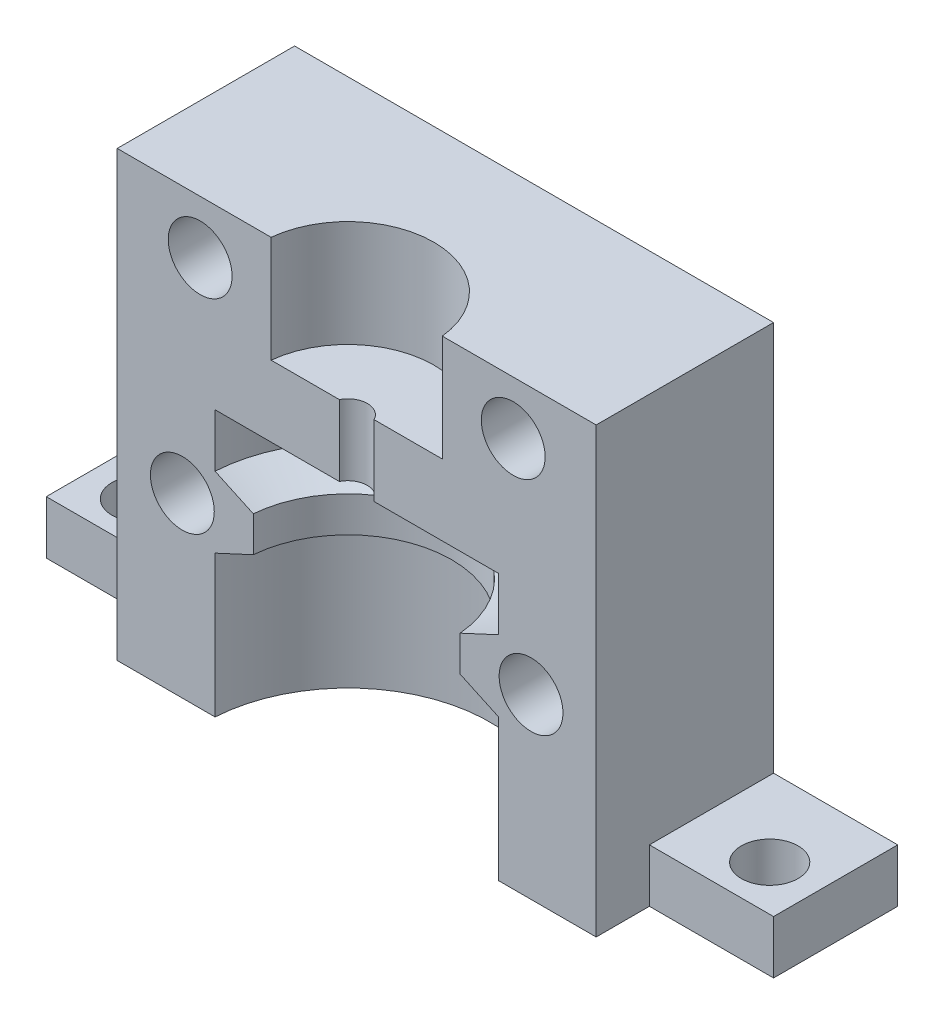
ISO-10303-21;
HEADER;
FILE_DESCRIPTION(('STEP AP214'),'2;1');
FILE_NAME('part.step','',(''),(''),'','','');
FILE_SCHEMA(('AUTOMOTIVE_DESIGN { 1 0 10303 214 1 1 1 1 }'));
ENDSEC;
DATA;
#1=APPLICATION_CONTEXT('core data for automotive mechanical design processes');
#2=APPLICATION_PROTOCOL_DEFINITION('international standard','automotive_design',2000,#1);
#3=PRODUCT_CONTEXT('',#1,'mechanical');
#4=PRODUCT('Part','Part','',(#3));
#5=PRODUCT_RELATED_PRODUCT_CATEGORY('part','',(#4));
#6=PRODUCT_DEFINITION_FORMATION('','',#4);
#7=PRODUCT_DEFINITION_CONTEXT('part definition',#1,'design');
#8=PRODUCT_DEFINITION('design','',#6,#7);
#9=PRODUCT_DEFINITION_SHAPE('','',#8);
#10=(LENGTH_UNIT() NAMED_UNIT(*) SI_UNIT(.MILLI.,.METRE.));
#11=(NAMED_UNIT(*) PLANE_ANGLE_UNIT() SI_UNIT($,.RADIAN.));
#12=(NAMED_UNIT(*) SI_UNIT($,.STERADIAN.) SOLID_ANGLE_UNIT());
#13=UNCERTAINTY_MEASURE_WITH_UNIT(LENGTH_MEASURE(1.E-05),#10,'distance_accuracy_value','');
#14=(GEOMETRIC_REPRESENTATION_CONTEXT(3) GLOBAL_UNCERTAINTY_ASSIGNED_CONTEXT((#13)) GLOBAL_UNIT_ASSIGNED_CONTEXT((#10,
#11,#12)) REPRESENTATION_CONTEXT('',''));
#15=CARTESIAN_POINT('',(0.,0.,0.));
#16=DIRECTION('',(0.,0.,1.));
#17=DIRECTION('',(1.,0.,0.));
#18=AXIS2_PLACEMENT_3D('',#15,#16,#17);
#19=CARTESIAN_POINT('',(-13.5,0.,0.));
#20=DIRECTION('',(0.,1.,0.));
#21=DIRECTION('',(0.,0.,1.));
#22=AXIS2_PLACEMENT_3D('',#19,#20,#21);
#23=PLANE('',#22);
#24=DIRECTION('',(1.,0.,0.));
#25=VECTOR('',#24,1.);
#26=CARTESIAN_POINT('',(-13.5,0.,0.));
#27=LINE('',#26,#25);
#28=CARTESIAN_POINT('',(7.98435971133566,0.,0.));
#29=VERTEX_POINT('',#28);
#30=CARTESIAN_POINT('',(13.5,0.,0.));
#31=VERTEX_POINT('',#30);
#32=EDGE_CURVE('E249',#29,#31,#27,.T.);
#33=ORIENTED_EDGE('',*,*,#32,.F.);
#34=CARTESIAN_POINT('',(0.,0.,0.499999999999999));
#35=DIRECTION('',(0.,1.,0.));
#36=DIRECTION('',(0.,0.,1.));
#37=AXIS2_PLACEMENT_3D('',#34,#35,#36);
#38=CIRCLE('',#37,8.);
#39=CARTESIAN_POINT('',(-7.98435971133566,0.,0.));
#40=VERTEX_POINT('',#39);
#41=EDGE_CURVE('E460',#29,#40,#38,.T.);
#42=ORIENTED_EDGE('',*,*,#41,.T.);
#43=CARTESIAN_POINT('',(-13.5,0.,0.));
#44=VERTEX_POINT('',#43);
#45=EDGE_CURVE('E256',#44,#40,#27,.T.);
#46=ORIENTED_EDGE('',*,*,#45,.F.);
#47=DIRECTION('',(0.,0.,1.));
#48=VECTOR('',#47,1.);
#49=CARTESIAN_POINT('',(-13.5,0.,-10.));
#50=LINE('',#49,#48);
#51=CARTESIAN_POINT('',(-13.5,0.,-3.));
#52=VERTEX_POINT('',#51);
#53=EDGE_CURVE('E247',#52,#44,#50,.T.);
#54=ORIENTED_EDGE('',*,*,#53,.F.);
#55=DIRECTION('',(1.,0.,0.));
#56=VECTOR('',#55,1.);
#57=CARTESIAN_POINT('',(-13.5,0.,-3.));
#58=LINE('',#57,#56);
#59=CARTESIAN_POINT('',(-20.5,0.,-3.));
#60=VERTEX_POINT('',#59);
#61=EDGE_CURVE('E54',#60,#52,#58,.T.);
#62=ORIENTED_EDGE('',*,*,#61,.F.);
#63=DIRECTION('',(0.,0.,1.));
#64=VECTOR('',#63,1.);
#65=CARTESIAN_POINT('',(-20.5,0.,-3.));
#66=LINE('',#65,#64);
#67=CARTESIAN_POINT('',(-20.5,0.,-10.));
#68=VERTEX_POINT('',#67);
#69=EDGE_CURVE('E198',#68,#60,#66,.T.);
#70=ORIENTED_EDGE('',*,*,#69,.F.);
#71=DIRECTION('',(-1.,0.,0.));
#72=VECTOR('',#71,1.);
#73=CARTESIAN_POINT('',(-13.5,0.,-10.));
#74=LINE('',#73,#72);
#75=CARTESIAN_POINT('',(20.5,0.,-10.));
#76=VERTEX_POINT('',#75);
#77=EDGE_CURVE('E262',#76,#68,#74,.T.);
#78=ORIENTED_EDGE('',*,*,#77,.F.);
#79=DIRECTION('',(0.,0.,1.));
#80=VECTOR('',#79,1.);
#81=CARTESIAN_POINT('',(20.5,0.,-3.));
#82=LINE('',#81,#80);
#83=CARTESIAN_POINT('',(20.5,0.,-3.));
#84=VERTEX_POINT('',#83);
#85=EDGE_CURVE('E222',#76,#84,#82,.T.);
#86=ORIENTED_EDGE('',*,*,#85,.T.);
#87=DIRECTION('',(-1.,0.,0.));
#88=VECTOR('',#87,1.);
#89=CARTESIAN_POINT('',(13.5,0.,-3.));
#90=LINE('',#89,#88);
#91=CARTESIAN_POINT('',(13.5,0.,-3.));
#92=VERTEX_POINT('',#91);
#93=EDGE_CURVE('E231',#84,#92,#90,.T.);
#94=ORIENTED_EDGE('',*,*,#93,.T.);
#95=DIRECTION('',(0.,0.,-1.));
#96=VECTOR('',#95,1.);
#97=CARTESIAN_POINT('',(13.5,0.,-10.));
#98=LINE('',#97,#96);
#99=EDGE_CURVE('E259',#31,#92,#98,.T.);
#100=ORIENTED_EDGE('',*,*,#99,.F.);
#101=EDGE_LOOP('',(#33,#42,#46,#54,#62,#70,#78,#86,#94,#100));
#102=FACE_BOUND('',#101,.T.);
#103=CARTESIAN_POINT('',(17.7373503171622,0.,-5.54426134233362));
#104=DIRECTION('',(0.,-1.,0.));
#105=DIRECTION('',(0.,0.,-1.));
#106=AXIS2_PLACEMENT_3D('',#103,#104,#105);
#107=CIRCLE('',#106,1.60000000000001);
#108=CARTESIAN_POINT('',(17.7373503171622,0.,-7.14426134233363));
#109=VERTEX_POINT('',#108);
#110=EDGE_CURVE('E215',#109,#109,#107,.T.);
#111=ORIENTED_EDGE('',*,*,#110,.F.);
#112=EDGE_LOOP('',(#111));
#113=FACE_BOUND('',#112,.T.);
#114=CARTESIAN_POINT('',(-17.7373503171622,0.,-5.54426134233362));
#115=DIRECTION('',(0.,1.,0.));
#116=DIRECTION('',(0.,0.,-1.));
#117=AXIS2_PLACEMENT_3D('',#114,#115,#116);
#118=CIRCLE('',#117,1.60000000000001);
#119=CARTESIAN_POINT('',(-17.7373503171622,0.,-7.14426134233363));
#120=VERTEX_POINT('',#119);
#121=EDGE_CURVE('E206',#120,#120,#118,.T.);
#122=ORIENTED_EDGE('',*,*,#121,.T.);
#123=EDGE_LOOP('',(#122));
#124=FACE_BOUND('',#123,.T.);
#125=ADVANCED_FACE('F37',(#102,#113,#124),#23,.F.);
#126=CARTESIAN_POINT('',(-13.5,3.,-10.));
#127=DIRECTION('',(0.,-1.,0.));
#128=DIRECTION('',(0.,0.,-1.));
#129=AXIS2_PLACEMENT_3D('',#126,#127,#128);
#130=PLANE('',#129);
#131=DIRECTION('',(0.,0.,-1.));
#132=VECTOR('',#131,1.);
#133=CARTESIAN_POINT('',(-13.5,3.,-3.));
#134=LINE('',#133,#132);
#135=CARTESIAN_POINT('',(-13.5,3.,-3.));
#136=VERTEX_POINT('',#135);
#137=CARTESIAN_POINT('',(-13.5,3.,-10.));
#138=VERTEX_POINT('',#137);
#139=EDGE_CURVE('E183',#136,#138,#134,.T.);
#140=ORIENTED_EDGE('',*,*,#139,.T.);
#141=DIRECTION('',(-1.,0.,0.));
#142=VECTOR('',#141,1.);
#143=CARTESIAN_POINT('',(-13.5,3.,-10.));
#144=LINE('',#143,#142);
#145=CARTESIAN_POINT('',(-20.5,3.,-10.));
#146=VERTEX_POINT('',#145);
#147=EDGE_CURVE('E194',#138,#146,#144,.T.);
#148=ORIENTED_EDGE('',*,*,#147,.T.);
#149=DIRECTION('',(0.,0.,1.));
#150=VECTOR('',#149,1.);
#151=CARTESIAN_POINT('',(-20.5,3.,-3.));
#152=LINE('',#151,#150);
#153=CARTESIAN_POINT('',(-20.5,3.,-3.));
#154=VERTEX_POINT('',#153);
#155=EDGE_CURVE('E186',#146,#154,#152,.T.);
#156=ORIENTED_EDGE('',*,*,#155,.T.);
#157=DIRECTION('',(1.,0.,0.));
#158=VECTOR('',#157,1.);
#159=CARTESIAN_POINT('',(-13.5,3.,-3.));
#160=LINE('',#159,#158);
#161=EDGE_CURVE('E179',#154,#136,#160,.T.);
#162=ORIENTED_EDGE('',*,*,#161,.T.);
#163=EDGE_LOOP('',(#140,#148,#156,#162));
#164=FACE_BOUND('',#163,.T.);
#165=CARTESIAN_POINT('',(-17.7373503171622,3.,-5.54426134233362));
#166=DIRECTION('',(0.,-1.,0.));
#167=DIRECTION('',(0.,0.,-1.));
#168=AXIS2_PLACEMENT_3D('',#165,#166,#167);
#169=CIRCLE('',#168,1.60000000000001);
#170=CARTESIAN_POINT('',(-17.7373503171622,3.,-7.14426134233363));
#171=VERTEX_POINT('',#170);
#172=EDGE_CURVE('E501',#171,#171,#169,.T.);
#173=ORIENTED_EDGE('',*,*,#172,.T.);
#174=EDGE_LOOP('',(#173));
#175=FACE_BOUND('',#174,.T.);
#176=ADVANCED_FACE('F180',(#164,#175),#130,.F.);
#177=CARTESIAN_POINT('',(-13.5,15.,-10.));
#178=DIRECTION('',(1.,0.,0.));
#179=DIRECTION('',(0.,0.,-1.));
#180=AXIS2_PLACEMENT_3D('',#177,#178,#179);
#181=PLANE('',#180);
#182=ORIENTED_EDGE('',*,*,#139,.F.);
#183=DIRECTION('',(0.,-1.,0.));
#184=VECTOR('',#183,1.);
#185=CARTESIAN_POINT('',(-13.5,3.,-3.));
#186=LINE('',#185,#184);
#187=EDGE_CURVE('E189',#136,#52,#186,.T.);
#188=ORIENTED_EDGE('',*,*,#187,.T.);
#189=ORIENTED_EDGE('',*,*,#53,.T.);
#190=DIRECTION('',(0.,-1.,0.));
#191=VECTOR('',#190,1.);
#192=CARTESIAN_POINT('',(-13.5,15.,0.));
#193=LINE('',#192,#191);
#194=CARTESIAN_POINT('',(-13.5,25.,0.));
#195=VERTEX_POINT('',#194);
#196=EDGE_CURVE('E12',#195,#44,#193,.T.);
#197=ORIENTED_EDGE('',*,*,#196,.F.);
#198=DIRECTION('',(0.,0.,1.));
#199=VECTOR('',#198,1.);
#200=CARTESIAN_POINT('',(-13.5,25.,0.));
#201=LINE('',#200,#199);
#202=CARTESIAN_POINT('',(-13.5,25.,-10.));
#203=VERTEX_POINT('',#202);
#204=EDGE_CURVE('E435',#203,#195,#201,.T.);
#205=ORIENTED_EDGE('',*,*,#204,.F.);
#206=DIRECTION('',(0.,-1.,0.));
#207=VECTOR('',#206,1.);
#208=CARTESIAN_POINT('',(-13.5,15.,-10.));
#209=LINE('',#208,#207);
#210=EDGE_CURVE('E197',#203,#138,#209,.T.);
#211=ORIENTED_EDGE('',*,*,#210,.T.);
#212=EDGE_LOOP('',(#182,#188,#189,#197,#205,#211));
#213=FACE_BOUND('',#212,.T.);
#214=ADVANCED_FACE('F39',(#213),#181,.F.);
#215=CARTESIAN_POINT('',(13.5,15.,-10.));
#216=DIRECTION('',(-1.,0.,0.));
#217=DIRECTION('',(0.,0.,1.));
#218=AXIS2_PLACEMENT_3D('',#215,#216,#217);
#219=PLANE('',#218);
#220=DIRECTION('',(0.,-1.,0.));
#221=VECTOR('',#220,1.);
#222=CARTESIAN_POINT('',(13.5,3.,-3.));
#223=LINE('',#222,#221);
#224=CARTESIAN_POINT('',(13.5,3.,-3.));
#225=VERTEX_POINT('',#224);
#226=EDGE_CURVE('E238',#225,#92,#223,.T.);
#227=ORIENTED_EDGE('',*,*,#226,.F.);
#228=DIRECTION('',(0.,0.,-1.));
#229=VECTOR('',#228,1.);
#230=CARTESIAN_POINT('',(13.5,3.,-3.));
#231=LINE('',#230,#229);
#232=CARTESIAN_POINT('',(13.5,3.,-10.));
#233=VERTEX_POINT('',#232);
#234=EDGE_CURVE('E228',#225,#233,#231,.T.);
#235=ORIENTED_EDGE('',*,*,#234,.T.);
#236=DIRECTION('',(0.,-1.,0.));
#237=VECTOR('',#236,1.);
#238=CARTESIAN_POINT('',(13.5,15.,-10.));
#239=LINE('',#238,#237);
#240=CARTESIAN_POINT('',(13.5,25.,-10.));
#241=VERTEX_POINT('',#240);
#242=EDGE_CURVE('E232',#241,#233,#239,.T.);
#243=ORIENTED_EDGE('',*,*,#242,.F.);
#244=DIRECTION('',(0.,0.,-1.));
#245=VECTOR('',#244,1.);
#246=CARTESIAN_POINT('',(13.5,25.,-10.));
#247=LINE('',#246,#245);
#248=CARTESIAN_POINT('',(13.5,25.,0.));
#249=VERTEX_POINT('',#248);
#250=EDGE_CURVE('E430',#249,#241,#247,.T.);
#251=ORIENTED_EDGE('',*,*,#250,.F.);
#252=DIRECTION('',(0.,-1.,0.));
#253=VECTOR('',#252,1.);
#254=CARTESIAN_POINT('',(13.5,15.,0.));
#255=LINE('',#254,#253);
#256=EDGE_CURVE('E46',#249,#31,#255,.T.);
#257=ORIENTED_EDGE('',*,*,#256,.T.);
#258=ORIENTED_EDGE('',*,*,#99,.T.);
#259=EDGE_LOOP('',(#227,#235,#243,#251,#257,#258));
#260=FACE_BOUND('',#259,.T.);
#261=ADVANCED_FACE('F352',(#260),#219,.F.);
#262=CARTESIAN_POINT('',(-13.5,15.,0.));
#263=DIRECTION('',(0.,0.,-1.));
#264=DIRECTION('',(-1.,0.,0.));
#265=AXIS2_PLACEMENT_3D('',#262,#263,#264);
#266=PLANE('',#265);
#267=CARTESIAN_POINT('',(9.82859331228385,10.,0.));
#268=DIRECTION('',(0.,0.,-1.));
#269=DIRECTION('',(-1.,0.,0.));
#270=AXIS2_PLACEMENT_3D('',#267,#268,#269);
#271=CIRCLE('',#270,1.8);
#272=CARTESIAN_POINT('',(8.02859331228385,10.,0.));
#273=VERTEX_POINT('',#272);
#274=EDGE_CURVE('E324',#273,#273,#271,.T.);
#275=ORIENTED_EDGE('',*,*,#274,.T.);
#276=EDGE_LOOP('',(#275));
#277=FACE_BOUND('',#276,.T.);
#278=DIRECTION('',(0.,1.,0.));
#279=VECTOR('',#278,1.);
#280=CARTESIAN_POINT('',(7.98435971133565,0.,0.));
#281=LINE('',#280,#279);
#282=CARTESIAN_POINT('',(7.98435971133565,15.,0.));
#283=VERTEX_POINT('',#282);
#284=CARTESIAN_POINT('',(7.98435971133565,12.,0.));
#285=VERTEX_POINT('',#284);
#286=EDGE_CURVE('E297',#283,#285,#281,.F.);
#287=ORIENTED_EDGE('',*,*,#286,.T.);
#288=CARTESIAN_POINT('',(2.11535569235546,9.29006713363907,0.));
#289=CARTESIAN_POINT('',(2.28843424212579,9.36845555425035,0.));
#290=CARTESIAN_POINT('',(2.46135809427136,9.44718369755756,0.));
#291=CARTESIAN_POINT('',(2.80699341090582,9.60510377794575,0.));
#292=CARTESIAN_POINT('',(2.97970487600083,9.6842957136994,0.));
#293=CARTESIAN_POINT('',(3.32501273266105,9.84292786473642,0.));
#294=CARTESIAN_POINT('',(3.49760912467847,9.92236807903706,0.));
#295=CARTESIAN_POINT('',(3.84272455690079,10.0814167211174,0.));
#296=CARTESIAN_POINT('',(4.01524359704566,10.1610251490274,0.));
#297=CARTESIAN_POINT('',(4.50245254098553,10.3860351010498,0.));
#298=CARTESIAN_POINT('',(4.81708318181361,10.5315649031306,0.));
#299=CARTESIAN_POINT('',(5.44625247740652,10.8228247185676,0.));
#300=CARTESIAN_POINT('',(5.7607911319925,10.9685547323101,0.));
#301=CARTESIAN_POINT('',(6.58639938294781,11.351262944539,0.));
#302=CARTESIAN_POINT('',(7.09742300372941,11.5883403158119,0.));
#303=CARTESIAN_POINT('',(8.11939563826729,12.0626557871997,0.));
#304=CARTESIAN_POINT('',(8.63034465202201,12.2998938873179,0.));
#305=CARTESIAN_POINT('',(9.65219514703247,12.7744632624229,0.));
#306=CARTESIAN_POINT('',(10.1630966285901,13.0117945367597,0.));
#307=CARTESIAN_POINT('',(11.1848704326492,13.4865197242159,0.));
#308=CARTESIAN_POINT('',(11.6957427551534,13.7239136373295,0.));
#309=CARTESIAN_POINT('',(12.2066079799039,13.9613228107752,0.));
#310=B_SPLINE_CURVE_WITH_KNOTS('',3,(#288,#289,#290,#291,#292,#293,#294,#295,#296,#297,#298,
#299,#300,#301,#302,#303,#304,#305,#306,#307,#308,#309),.UNSPECIFIED.,.F.,.F.,(4,2,2,2,2,2,2,2,
2,2,4),(0.,0.570005901467569,1.14001017243245,1.71001219006862,2.28001464922537,
3.31998675309213,4.35996086574241,6.04997777390132,7.73999471727294,9.43000007169726,
11.1200052701719),.UNSPECIFIED.);
#311=CARTESIAN_POINT('',(5.82859331228385,11.,0.));
#312=VERTEX_POINT('',#311);
#313=EDGE_CURVE('E339',#312,#285,#310,.T.);
#314=ORIENTED_EDGE('',*,*,#313,.F.);
#315=DIRECTION('',(0.,1.,0.));
#316=VECTOR('',#315,1.);
#317=CARTESIAN_POINT('',(5.82859331228385,9.,0.));
#318=LINE('',#317,#316);
#319=CARTESIAN_POINT('',(5.82859331228385,9.,0.));
#320=VERTEX_POINT('',#319);
#321=EDGE_CURVE('E465',#320,#312,#318,.T.);
#322=ORIENTED_EDGE('',*,*,#321,.F.);
#323=CARTESIAN_POINT('',(12.2066079799039,6.03867718922485,0.));
#324=CARTESIAN_POINT('',(11.1848570920835,6.51346464011942,0.));
#325=CARTESIAN_POINT('',(10.1631058329647,6.98825143485313,0.));
#326=CARTESIAN_POINT('',(8.63033376421538,7.70011485811317,0.));
#327=CARTESIAN_POINT('',(8.11938633439286,7.93734950466258,0.));
#328=CARTESIAN_POINT('',(7.09741792901154,8.41166106564895,0.));
#329=CARTESIAN_POINT('',(6.58639695341554,8.64873798000577,0.));
#330=CARTESIAN_POINT('',(5.74566596145119,9.03845662489266,0.));
#331=CARTESIAN_POINT('',(5.41599928648852,9.191191847511,0.));
#332=CARTESIAN_POINT('',(4.75656256904793,9.49643814932566,0.));
#333=CARTESIAN_POINT('',(4.42679252668473,9.64894922876966,0.));
#334=CARTESIAN_POINT('',(3.93198824860946,9.87739449934496,0.));
#335=CARTESIAN_POINT('',(3.76702828873398,9.95348951726582,0.));
#336=CARTESIAN_POINT('',(3.43703362486488,10.1055169694073,0.));
#337=CARTESIAN_POINT('',(3.27199892092821,10.1814494037516,0.));
#338=CARTESIAN_POINT('',(2.9418192878395,10.3330763286103,0.));
#339=CARTESIAN_POINT('',(2.77667435825716,10.4087708181891,0.));
#340=CARTESIAN_POINT('',(2.44618595176209,10.5597260924228,0.));
#341=CARTESIAN_POINT('',(2.28084247430407,10.6349868758832,0.));
#342=CARTESIAN_POINT('',(2.11535569235546,10.7099328663609,0.));
#343=B_SPLINE_CURVE_WITH_KNOTS('',3,(#323,#324,#325,#326,#327,#328,#329,#330,#331,#332,#333,
#334,#335,#336,#337,#338,#339,#340,#341,#342),.UNSPECIFIED.,.F.,.F.,(4,2,2,2,2,2,2,2,2,4),(0.,
3.38002699376651,5.07003526690187,6.76004439807376,7.8500322022747,8.94001880113217,
9.48501428952632,10.0300093632776,10.5750065772217,11.120005291374),.UNSPECIFIED.);
#344=CARTESIAN_POINT('',(7.98435971133565,8.,0.));
#345=VERTEX_POINT('',#344);
#346=EDGE_CURVE('E331',#345,#320,#343,.T.);
#347=ORIENTED_EDGE('',*,*,#346,.F.);
#348=EDGE_CURVE('E463',#345,#29,#281,.F.);
#349=ORIENTED_EDGE('',*,*,#348,.T.);
#350=ORIENTED_EDGE('',*,*,#32,.T.);
#351=ORIENTED_EDGE('',*,*,#256,.F.);
#352=DIRECTION('',(1.,0.,0.));
#353=VECTOR('',#352,1.);
#354=CARTESIAN_POINT('',(13.5,25.,0.));
#355=LINE('',#354,#353);
#356=CARTESIAN_POINT('',(4.82415795761291,25.,0.));
#357=VERTEX_POINT('',#356);
#358=EDGE_CURVE('E427',#357,#249,#355,.T.);
#359=ORIENTED_EDGE('',*,*,#358,.F.);
#360=DIRECTION('',(0.,-1.,0.));
#361=VECTOR('',#360,1.);
#362=CARTESIAN_POINT('',(4.82415795761291,25.,0.));
#363=LINE('',#362,#361);
#364=CARTESIAN_POINT('',(4.82415795761291,19.,0.));
#365=VERTEX_POINT('',#364);
#366=EDGE_CURVE('E270',#357,#365,#363,.T.);
#367=ORIENTED_EDGE('',*,*,#366,.T.);
#368=DIRECTION('',(1.,0.,0.));
#369=VECTOR('',#368,1.);
#370=CARTESIAN_POINT('',(13.5,19.,0.));
#371=LINE('',#370,#369);
#372=CARTESIAN_POINT('',(0.979795897113271,19.,0.));
#373=VERTEX_POINT('',#372);
#374=EDGE_CURVE('E287',#373,#365,#371,.T.);
#375=ORIENTED_EDGE('',*,*,#374,.F.);
#376=DIRECTION('',(0.,-1.,0.));
#377=VECTOR('',#376,1.);
#378=CARTESIAN_POINT('',(0.979795897113271,19.,0.));
#379=LINE('',#378,#377);
#380=CARTESIAN_POINT('',(0.979795897113271,15.,0.));
#381=VERTEX_POINT('',#380);
#382=EDGE_CURVE('E327',#373,#381,#379,.T.);
#383=ORIENTED_EDGE('',*,*,#382,.T.);
#384=DIRECTION('',(1.,0.,0.));
#385=VECTOR('',#384,1.);
#386=CARTESIAN_POINT('',(13.5,15.,0.));
#387=LINE('',#386,#385);
#388=EDGE_CURVE('E305',#381,#283,#387,.T.);
#389=ORIENTED_EDGE('',*,*,#388,.T.);
#390=EDGE_LOOP('',(#287,#314,#322,#347,#349,#350,#351,#359,#367,#375,#383,#389));
#391=FACE_BOUND('',#390,.T.);
#392=CARTESIAN_POINT('',(8.82415795761291,22.,0.));
#393=DIRECTION('',(0.,0.,-1.));
#394=DIRECTION('',(-1.,0.,0.));
#395=AXIS2_PLACEMENT_3D('',#392,#393,#394);
#396=CIRCLE('',#395,1.8);
#397=CARTESIAN_POINT('',(7.02415795761291,22.,0.));
#398=VERTEX_POINT('',#397);
#399=EDGE_CURVE('E240',#398,#398,#396,.T.);
#400=ORIENTED_EDGE('',*,*,#399,.T.);
#401=EDGE_LOOP('',(#400));
#402=FACE_BOUND('',#401,.T.);
#403=ADVANCED_FACE('F347',(#277,#391,#402),#266,.F.);
#404=CARTESIAN_POINT('',(-13.5,15.,-10.));
#405=DIRECTION('',(0.,0.,1.));
#406=DIRECTION('',(1.,0.,0.));
#407=AXIS2_PLACEMENT_3D('',#404,#405,#406);
#408=PLANE('',#407);
#409=CARTESIAN_POINT('',(9.82859331228385,10.,-10.));
#410=DIRECTION('',(0.,0.,-1.));
#411=DIRECTION('',(-1.,0.,0.));
#412=AXIS2_PLACEMENT_3D('',#409,#410,#411);
#413=CIRCLE('',#412,1.8);
#414=CARTESIAN_POINT('',(8.02859331228385,10.,-10.));
#415=VERTEX_POINT('',#414);
#416=EDGE_CURVE('E320',#415,#415,#413,.T.);
#417=ORIENTED_EDGE('',*,*,#416,.F.);
#418=EDGE_LOOP('',(#417));
#419=FACE_BOUND('',#418,.T.);
#420=CARTESIAN_POINT('',(-9.82859331228385,10.,-10.));
#421=DIRECTION('',(0.,0.,1.));
#422=DIRECTION('',(1.,0.,0.));
#423=AXIS2_PLACEMENT_3D('',#420,#421,#422);
#424=CIRCLE('',#423,1.8);
#425=CARTESIAN_POINT('',(-8.02859331228385,10.,-10.));
#426=VERTEX_POINT('',#425);
#427=EDGE_CURVE('E328',#426,#426,#424,.T.);
#428=ORIENTED_EDGE('',*,*,#427,.T.);
#429=EDGE_LOOP('',(#428));
#430=FACE_BOUND('',#429,.T.);
#431=ORIENTED_EDGE('',*,*,#77,.T.);
#432=DIRECTION('',(0.,-1.,0.));
#433=VECTOR('',#432,1.);
#434=CARTESIAN_POINT('',(-20.5,3.,-10.));
#435=LINE('',#434,#433);
#436=EDGE_CURVE('E219',#146,#68,#435,.T.);
#437=ORIENTED_EDGE('',*,*,#436,.F.);
#438=ORIENTED_EDGE('',*,*,#147,.F.);
#439=ORIENTED_EDGE('',*,*,#210,.F.);
#440=DIRECTION('',(-1.,0.,0.));
#441=VECTOR('',#440,1.);
#442=CARTESIAN_POINT('',(-13.5,25.,-10.));
#443=LINE('',#442,#441);
#444=EDGE_CURVE('E433',#241,#203,#443,.T.);
#445=ORIENTED_EDGE('',*,*,#444,.F.);
#446=ORIENTED_EDGE('',*,*,#242,.T.);
#447=DIRECTION('',(1.,0.,0.));
#448=VECTOR('',#447,1.);
#449=CARTESIAN_POINT('',(13.5,3.,-10.));
#450=LINE('',#449,#448);
#451=CARTESIAN_POINT('',(20.5,3.,-10.));
#452=VERTEX_POINT('',#451);
#453=EDGE_CURVE('E62',#233,#452,#450,.T.);
#454=ORIENTED_EDGE('',*,*,#453,.T.);
#455=DIRECTION('',(0.,-1.,0.));
#456=VECTOR('',#455,1.);
#457=CARTESIAN_POINT('',(20.5,3.,-10.));
#458=LINE('',#457,#456);
#459=EDGE_CURVE('E421',#452,#76,#458,.T.);
#460=ORIENTED_EDGE('',*,*,#459,.T.);
#461=EDGE_LOOP('',(#431,#437,#438,#439,#445,#446,#454,#460));
#462=FACE_BOUND('',#461,.T.);
#463=CARTESIAN_POINT('',(-8.82415795761291,22.,-10.));
#464=DIRECTION('',(0.,0.,1.));
#465=DIRECTION('',(1.,0.,0.));
#466=AXIS2_PLACEMENT_3D('',#463,#464,#465);
#467=CIRCLE('',#466,1.8);
#468=CARTESIAN_POINT('',(-7.02415795761291,22.,-10.));
#469=VERTEX_POINT('',#468);
#470=EDGE_CURVE('E277',#469,#469,#467,.T.);
#471=ORIENTED_EDGE('',*,*,#470,.T.);
#472=EDGE_LOOP('',(#471));
#473=FACE_BOUND('',#472,.T.);
#474=CARTESIAN_POINT('',(8.82415795761291,22.,-10.));
#475=DIRECTION('',(0.,0.,-1.));
#476=DIRECTION('',(-1.,0.,0.));
#477=AXIS2_PLACEMENT_3D('',#474,#475,#476);
#478=CIRCLE('',#477,1.8);
#479=CARTESIAN_POINT('',(7.02415795761291,22.,-10.));
#480=VERTEX_POINT('',#479);
#481=EDGE_CURVE('E412',#480,#480,#478,.T.);
#482=ORIENTED_EDGE('',*,*,#481,.F.);
#483=EDGE_LOOP('',(#482));
#484=FACE_BOUND('',#483,.T.);
#485=ADVANCED_FACE('F351',(#419,#430,#462,#473,#484),#408,.F.);
#486=CARTESIAN_POINT('',(0.,19.,0.5));
#487=DIRECTION('',(0.,-1.,0.));
#488=DIRECTION('',(0.,0.,-1.));
#489=AXIS2_PLACEMENT_3D('',#486,#487,#488);
#490=PLANE('',#489);
#491=CARTESIAN_POINT('',(0.,19.,0.5));
#492=DIRECTION('',(0.,-1.,0.));
#493=DIRECTION('',(0.,0.,-1.));
#494=AXIS2_PLACEMENT_3D('',#491,#492,#493);
#495=CIRCLE('',#494,4.85);
#496=CARTESIAN_POINT('',(-4.82415795761291,19.,0.));
#497=VERTEX_POINT('',#496);
#498=EDGE_CURVE('E272',#497,#365,#495,.T.);
#499=ORIENTED_EDGE('',*,*,#498,.F.);
#500=DIRECTION('',(1.,0.,0.));
#501=VECTOR('',#500,1.);
#502=CARTESIAN_POINT('',(-0.979795897113271,19.,0.));
#503=LINE('',#502,#501);
#504=CARTESIAN_POINT('',(-0.979795897113271,19.,0.));
#505=VERTEX_POINT('',#504);
#506=EDGE_CURVE('E296',#497,#505,#503,.T.);
#507=ORIENTED_EDGE('',*,*,#506,.T.);
#508=CARTESIAN_POINT('',(0.,19.,0.5));
#509=DIRECTION('',(0.,-1.,0.));
#510=DIRECTION('',(0.,0.,-1.));
#511=AXIS2_PLACEMENT_3D('',#508,#509,#510);
#512=CIRCLE('',#511,1.1);
#513=EDGE_CURVE('E284',#505,#373,#512,.T.);
#514=ORIENTED_EDGE('',*,*,#513,.T.);
#515=ORIENTED_EDGE('',*,*,#374,.T.);
#516=EDGE_LOOP('',(#499,#507,#514,#515));
#517=FACE_BOUND('',#516,.T.);
#518=ADVANCED_FACE('F392',(#517),#490,.F.);
#519=CARTESIAN_POINT('',(0.,0.,0.499999999999999));
#520=DIRECTION('',(0.,1.,0.));
#521=DIRECTION('',(0.,0.,1.));
#522=AXIS2_PLACEMENT_3D('',#519,#520,#521);
#523=CYLINDRICAL_SURFACE('',#522,8.);
#524=DIRECTION('',(0.,1.,0.));
#525=VECTOR('',#524,1.);
#526=CARTESIAN_POINT('',(-7.98435971133565,0.,0.));
#527=LINE('',#526,#525);
#528=CARTESIAN_POINT('',(-7.98435971133565,12.,0.));
#529=VERTEX_POINT('',#528);
#530=CARTESIAN_POINT('',(-7.98435971133565,15.,0.));
#531=VERTEX_POINT('',#530);
#532=EDGE_CURVE('E469',#529,#531,#527,.T.);
#533=ORIENTED_EDGE('',*,*,#532,.F.);
#534=CARTESIAN_POINT('',(0.,12.,0.5));
#535=DIRECTION('',(0.,-1.,0.));
#536=DIRECTION('',(0.,0.,-1.));
#537=AXIS2_PLACEMENT_3D('',#534,#535,#536);
#538=CIRCLE('',#537,8.);
#539=EDGE_CURVE('E371',#529,#285,#538,.T.);
#540=ORIENTED_EDGE('',*,*,#539,.T.);
#541=ORIENTED_EDGE('',*,*,#286,.F.);
#542=CARTESIAN_POINT('',(0.,15.,0.5));
#543=DIRECTION('',(0.,1.,0.));
#544=DIRECTION('',(0.,0.,1.));
#545=AXIS2_PLACEMENT_3D('',#542,#543,#544);
#546=CIRCLE('',#545,8.);
#547=EDGE_CURVE('E458',#283,#531,#546,.T.);
#548=ORIENTED_EDGE('',*,*,#547,.T.);
#549=EDGE_LOOP('',(#533,#540,#541,#548));
#550=FACE_BOUND('',#549,.T.);
#551=ADVANCED_FACE('F388',(#550),#523,.F.);
#552=CARTESIAN_POINT('',(-8.82415795761291,22.,0.));
#553=DIRECTION('',(0.,0.,1.));
#554=DIRECTION('',(1.,0.,0.));
#555=AXIS2_PLACEMENT_3D('',#552,#553,#554);
#556=CIRCLE('',#555,1.8);
#557=CARTESIAN_POINT('',(-7.02415795761291,22.,0.));
#558=VERTEX_POINT('',#557);
#559=EDGE_CURVE('E414',#558,#558,#556,.T.);
#560=ORIENTED_EDGE('',*,*,#559,.F.);
#561=EDGE_LOOP('',(#560));
#562=FACE_BOUND('',#561,.T.);
#563=CARTESIAN_POINT('',(-9.82859331228385,10.,0.));
#564=DIRECTION('',(0.,0.,1.));
#565=DIRECTION('',(1.,0.,0.));
#566=AXIS2_PLACEMENT_3D('',#563,#564,#565);
#567=CIRCLE('',#566,1.8);
#568=CARTESIAN_POINT('',(-8.02859331228385,10.,0.));
#569=VERTEX_POINT('',#568);
#570=EDGE_CURVE('E323',#569,#569,#567,.T.);
#571=ORIENTED_EDGE('',*,*,#570,.F.);
#572=EDGE_LOOP('',(#571));
#573=FACE_BOUND('',#572,.T.);
#574=CARTESIAN_POINT('',(-1.31739296684737,8.93445874884866,0.));
#575=CARTESIAN_POINT('',(-1.37387318921275,8.95902520741728,0.));
#576=CARTESIAN_POINT('',(-1.43028500591363,8.98374794738698,0.));
#577=CARTESIAN_POINT('',(-1.54300116919908,9.03343627367247,0.));
#578=CARTESIAN_POINT('',(-1.59930551654129,9.05840185826864,0.));
#579=CARTESIAN_POINT('',(-1.76810058417018,9.13355795030559,0.));
#580=CARTESIAN_POINT('',(-1.88047531424131,9.18400866482951,0.));
#581=CARTESIAN_POINT('',(-2.10503742297163,9.2853180414556,0.));
#582=CARTESIAN_POINT('',(-2.21722480556995,9.33617669484669,0.));
#583=CARTESIAN_POINT('',(-2.44147974823002,9.43815909118389,0.));
#584=CARTESIAN_POINT('',(-2.55354730758816,9.48928283567647,0.));
#585=CARTESIAN_POINT('',(-2.86573327310443,9.63199446311386,0.));
#586=CARTESIAN_POINT('',(-3.06576340652993,9.72377533393142,0.));
#587=CARTESIAN_POINT('',(-3.46568193572661,9.9076454266888,0.));
#588=CARTESIAN_POINT('',(-3.66557033138255,9.99973464887897,0.));
#589=CARTESIAN_POINT('',(-4.26510723276638,10.2762793460196,0.));
#590=CARTESIAN_POINT('',(-4.66462783949218,10.46101202899,0.));
#591=CARTESIAN_POINT('',(-5.46353231884836,10.8308055220388,0.));
#592=CARTESIAN_POINT('',(-5.86291618676336,11.0158663422931,0.));
#593=CARTESIAN_POINT('',(-6.66160010703181,11.3861683425065,0.));
#594=CARTESIAN_POINT('',(-7.06090015942037,11.5714095223899,0.));
#595=CARTESIAN_POINT('',(-7.97118031313717,11.9938482379421,0.));
#596=CARTESIAN_POINT('',(-8.48214477452035,12.2310794668471,0.));
#597=CARTESIAN_POINT('',(-9.50402756580302,12.7056414744016,0.));
#598=CARTESIAN_POINT('',(-10.0149458956949,12.9429722530674,0.));
#599=CARTESIAN_POINT('',(-11.0367296488966,13.4176850664492,0.));
#600=CARTESIAN_POINT('',(-11.5475950735636,13.6550670982442,0.));
#601=CARTESIAN_POINT('',(-12.5693057080007,14.1298744025313,0.));
#602=CARTESIAN_POINT('',(-13.0801509177747,14.367299675015,0.));
#603=CARTESIAN_POINT('',(-13.5909905001719,14.6047370509861,0.));
#604=B_SPLINE_CURVE_WITH_KNOTS('',3,(#574,#575,#576,#577,#578,#579,#580,#581,#582,#583,#584,
#585,#586,#587,#588,#589,#590,#591,#592,#593,#594,#595,#596,#597,#598,#599,#600,#601,#602,#603),
.UNSPECIFIED.,.F.,.F.,(4,2,2,2,2,2,2,2,2,2,2,2,2,2,4),(0.,0.184774021989635,0.369546736516865,
0.739085667512107,1.10861672831225,1.47814994727587,2.13839331681553,2.79863722254491,
4.1191237579159,5.4396519850327,6.76017965796267,8.45022994888025,10.1402805164147,
11.830251934276,13.5202230243217),.UNSPECIFIED.);
#605=CARTESIAN_POINT('',(-5.82859331228385,11.,0.));
#606=VERTEX_POINT('',#605);
#607=EDGE_CURVE('E360',#606,#529,#604,.T.);
#608=ORIENTED_EDGE('',*,*,#607,.T.);
#609=ORIENTED_EDGE('',*,*,#532,.T.);
#610=DIRECTION('',(1.,0.,0.));
#611=VECTOR('',#610,1.);
#612=CARTESIAN_POINT('',(-0.979795897113271,15.,0.));
#613=LINE('',#612,#611);
#614=CARTESIAN_POINT('',(-0.979795897113271,15.,0.));
#615=VERTEX_POINT('',#614);
#616=EDGE_CURVE('E288',#531,#615,#613,.T.);
#617=ORIENTED_EDGE('',*,*,#616,.T.);
#618=DIRECTION('',(0.,-1.,0.));
#619=VECTOR('',#618,1.);
#620=CARTESIAN_POINT('',(-0.979795897113271,19.,0.));
#621=LINE('',#620,#619);
#622=EDGE_CURVE('E299',#505,#615,#621,.T.);
#623=ORIENTED_EDGE('',*,*,#622,.F.);
#624=ORIENTED_EDGE('',*,*,#506,.F.);
#625=DIRECTION('',(0.,-1.,0.));
#626=VECTOR('',#625,1.);
#627=CARTESIAN_POINT('',(-4.82415795761291,25.,0.));
#628=LINE('',#627,#626);
#629=CARTESIAN_POINT('',(-4.82415795761291,25.,0.));
#630=VERTEX_POINT('',#629);
#631=EDGE_CURVE('E267',#630,#497,#628,.T.);
#632=ORIENTED_EDGE('',*,*,#631,.F.);
#633=DIRECTION('',(1.,0.,0.));
#634=VECTOR('',#633,1.);
#635=CARTESIAN_POINT('',(-4.82415795761291,25.,0.));
#636=LINE('',#635,#634);
#637=EDGE_CURVE('E271',#195,#630,#636,.T.);
#638=ORIENTED_EDGE('',*,*,#637,.F.);
#639=ORIENTED_EDGE('',*,*,#196,.T.);
#640=ORIENTED_EDGE('',*,*,#45,.T.);
#641=CARTESIAN_POINT('',(-7.98435971133565,8.,0.));
#642=VERTEX_POINT('',#641);
#643=EDGE_CURVE('E250',#40,#642,#527,.T.);
#644=ORIENTED_EDGE('',*,*,#643,.T.);
#645=CARTESIAN_POINT('',(-13.5909905001719,5.39526294901395,0.));
#646=CARTESIAN_POINT('',(-13.0801373376538,5.63270658910814,0.));
#647=CARTESIAN_POINT('',(-12.5692785744383,5.87013818439638,0.));
#648=CARTESIAN_POINT('',(-11.5475417292871,6.34495771424338,0.));
#649=CARTESIAN_POINT('',(-11.036663647383,6.58234564886981,0.));
#650=CARTESIAN_POINT('',(-10.0148807335319,7.05705796803931,0.));
#651=CARTESIAN_POINT('',(-9.50397590171474,7.29438235286159,0.));
#652=CARTESIAN_POINT('',(-8.48211946545057,7.76893245215398,0.));
#653=CARTESIAN_POINT('',(-7.97116786093374,8.00615816647369,0.));
#654=CARTESIAN_POINT('',(-7.20467727605257,8.36186672779482,0.));
#655=CARTESIAN_POINT('',(-6.94916871552337,8.48041512199336,0.));
#656=CARTESIAN_POINT('',(-6.43812328437261,8.71745050666757,0.));
#657=CARTESIAN_POINT('',(-6.18258641376691,8.83593749717745,0.));
#658=CARTESIAN_POINT('',(-5.67147317805286,9.0728232201772,0.));
#659=CARTESIAN_POINT('',(-5.41589681312951,9.19122195306619,0.));
#660=CARTESIAN_POINT('',(-4.9046826863568,9.42788818072644,0.));
#661=CARTESIAN_POINT('',(-4.64904492438584,9.54615567523514,0.));
#662=CARTESIAN_POINT('',(-4.13766721383353,9.78248006049735,0.));
#663=CARTESIAN_POINT('',(-3.88192726371537,9.9005369479255,0.));
#664=CARTESIAN_POINT('',(-3.37028134812616,10.1362870111922,0.));
#665=CARTESIAN_POINT('',(-3.11437538362939,10.2539801891423,0.));
#666=CARTESIAN_POINT('',(-2.73025760451298,10.4299636253113,0.));
#667=CARTESIAN_POINT('',(-2.60217363978244,10.4885327610096,0.));
#668=CARTESIAN_POINT('',(-2.34587402885806,10.6053805676131,0.));
#669=CARTESIAN_POINT('',(-2.21765838335094,10.663659240024,0.));
#670=CARTESIAN_POINT('',(-1.96101364225191,10.7797540259984,0.));
#671=CARTESIAN_POINT('',(-1.83258454166007,10.8375701285369,0.));
#672=CARTESIAN_POINT('',(-1.63966109520387,10.9236713285961,0.));
#673=CARTESIAN_POINT('',(-1.5753060779674,10.9522681526041,0.));
#674=CARTESIAN_POINT('',(-1.44646103212708,11.009157337199,0.));
#675=CARTESIAN_POINT('',(-1.38197100234972,11.0374496951261,0.));
#676=CARTESIAN_POINT('',(-1.31739296684737,11.0655412511513,0.));
#677=B_SPLINE_CURVE_WITH_KNOTS('',3,(#645,#646,#647,#648,#649,#650,#651,#652,#653,#654,#655,
#656,#657,#658,#659,#660,#661,#662,#663,#664,#665,#666,#667,#668,#669,#670,#671,#672,#673,#674,
#675,#676),.UNSPECIFIED.,.F.,.F.,(4,2,2,2,2,2,2,2,2,2,2,2,2,2,2,4),(0.,1.6900159566284,
3.38002927190713,5.07003503581705,6.76004336635924,7.60505526432901,8.45006669106988,
9.29507427296963,10.1400835423525,10.9851060378927,11.8301236183218,12.2526427319249,
12.6751596531339,13.097686614883,13.3089538245824,13.5202228782902),.UNSPECIFIED.);
#678=CARTESIAN_POINT('',(-5.82859331228385,9.,0.));
#679=VERTEX_POINT('',#678);
#680=EDGE_CURVE('E365',#642,#679,#677,.T.);
#681=ORIENTED_EDGE('',*,*,#680,.T.);
#682=DIRECTION('',(0.,1.,0.));
#683=VECTOR('',#682,1.);
#684=CARTESIAN_POINT('',(-5.82859331228385,9.,0.));
#685=LINE('',#684,#683);
#686=EDGE_CURVE('E461',#679,#606,#685,.T.);
#687=ORIENTED_EDGE('',*,*,#686,.T.);
#688=EDGE_LOOP('',(#608,#609,#617,#623,#624,#632,#638,#639,#640,#644,#681,#687));
#689=FACE_BOUND('',#688,.T.);
#690=ADVANCED_FACE('F354',(#562,#573,#689),#266,.F.);
#691=ORIENTED_EDGE('',*,*,#348,.F.);
#692=CARTESIAN_POINT('',(0.,8.,0.5));
#693=DIRECTION('',(0.,-1.,0.));
#694=DIRECTION('',(0.,0.,-1.));
#695=AXIS2_PLACEMENT_3D('',#692,#693,#694);
#696=CIRCLE('',#695,8.);
#697=EDGE_CURVE('E483',#642,#345,#696,.T.);
#698=ORIENTED_EDGE('',*,*,#697,.F.);
#699=ORIENTED_EDGE('',*,*,#643,.F.);
#700=ORIENTED_EDGE('',*,*,#41,.F.);
#701=EDGE_LOOP('',(#691,#698,#699,#700));
#702=FACE_BOUND('',#701,.T.);
#703=ADVANCED_FACE('F383',(#702),#523,.F.);
#704=CARTESIAN_POINT('',(0.,9.,0.5));
#705=DIRECTION('',(0.,1.,0.));
#706=DIRECTION('',(0.,0.,1.));
#707=AXIS2_PLACEMENT_3D('',#704,#705,#706);
#708=CYLINDRICAL_SURFACE('',#707,5.85);
#709=CARTESIAN_POINT('',(0.,11.,0.5));
#710=DIRECTION('',(0.,-1.,0.));
#711=DIRECTION('',(0.,0.,-1.));
#712=AXIS2_PLACEMENT_3D('',#709,#710,#711);
#713=CIRCLE('',#712,5.85);
#714=EDGE_CURVE('E581',#606,#312,#713,.T.);
#715=ORIENTED_EDGE('',*,*,#714,.F.);
#716=ORIENTED_EDGE('',*,*,#686,.F.);
#717=CARTESIAN_POINT('',(0.,9.,0.5));
#718=DIRECTION('',(0.,-1.,0.));
#719=DIRECTION('',(0.,0.,-1.));
#720=AXIS2_PLACEMENT_3D('',#717,#718,#719);
#721=CIRCLE('',#720,5.85);
#722=EDGE_CURVE('E582',#679,#320,#721,.T.);
#723=ORIENTED_EDGE('',*,*,#722,.T.);
#724=ORIENTED_EDGE('',*,*,#321,.T.);
#725=EDGE_LOOP('',(#715,#716,#723,#724));
#726=FACE_BOUND('',#725,.T.);
#727=ADVANCED_FACE('F380',(#726),#708,.F.);
#728=CARTESIAN_POINT('',(0.,12.,0.5));
#729=DIRECTION('',(0.,1.,0.));
#730=DIRECTION('',(0.,0.,1.));
#731=AXIS2_PLACEMENT_3D('',#728,#729,#730);
#732=CONICAL_SURFACE('',#731,8.,1.13544305164259);
#733=ORIENTED_EDGE('',*,*,#607,.F.);
#734=ORIENTED_EDGE('',*,*,#714,.T.);
#735=ORIENTED_EDGE('',*,*,#313,.T.);
#736=ORIENTED_EDGE('',*,*,#539,.F.);
#737=EDGE_LOOP('',(#733,#734,#735,#736));
#738=FACE_BOUND('',#737,.T.);
#739=ADVANCED_FACE('F377',(#738),#732,.F.);
#740=CARTESIAN_POINT('',(0.,9.,0.5));
#741=DIRECTION('',(0.,-1.,0.));
#742=DIRECTION('',(0.,0.,-1.));
#743=AXIS2_PLACEMENT_3D('',#740,#741,#742);
#744=CONICAL_SURFACE('',#743,5.85,1.13544305164259);
#745=ORIENTED_EDGE('',*,*,#680,.F.);
#746=ORIENTED_EDGE('',*,*,#697,.T.);
#747=ORIENTED_EDGE('',*,*,#346,.T.);
#748=ORIENTED_EDGE('',*,*,#722,.F.);
#749=EDGE_LOOP('',(#745,#746,#747,#748));
#750=FACE_BOUND('',#749,.T.);
#751=ADVANCED_FACE('F372',(#750),#744,.F.);
#752=CARTESIAN_POINT('',(-9.82859331228385,10.,-10.));
#753=DIRECTION('',(0.,0.,1.));
#754=DIRECTION('',(1.,0.,0.));
#755=AXIS2_PLACEMENT_3D('',#752,#753,#754);
#756=CYLINDRICAL_SURFACE('',#755,1.8);
#757=ORIENTED_EDGE('',*,*,#427,.F.);
#758=EDGE_LOOP('',(#757));
#759=FACE_BOUND('',#758,.T.);
#760=ORIENTED_EDGE('',*,*,#570,.T.);
#761=EDGE_LOOP('',(#760));
#762=FACE_BOUND('',#761,.T.);
#763=ADVANCED_FACE('F376',(#759,#762),#756,.F.);
#764=CARTESIAN_POINT('',(9.82859331228385,10.,-10.));
#765=DIRECTION('',(0.,0.,1.));
#766=DIRECTION('',(1.,0.,0.));
#767=AXIS2_PLACEMENT_3D('',#764,#765,#766);
#768=CYLINDRICAL_SURFACE('',#767,1.8);
#769=ORIENTED_EDGE('',*,*,#416,.T.);
#770=EDGE_LOOP('',(#769));
#771=FACE_BOUND('',#770,.T.);
#772=ORIENTED_EDGE('',*,*,#274,.F.);
#773=EDGE_LOOP('',(#772));
#774=FACE_BOUND('',#773,.T.);
#775=ADVANCED_FACE('F552',(#771,#774),#768,.F.);
#776=CARTESIAN_POINT('',(0.,15.,0.5));
#777=DIRECTION('',(0.,-1.,0.));
#778=DIRECTION('',(0.,0.,-1.));
#779=AXIS2_PLACEMENT_3D('',#776,#777,#778);
#780=PLANE('',#779);
#781=ORIENTED_EDGE('',*,*,#547,.F.);
#782=ORIENTED_EDGE('',*,*,#388,.F.);
#783=CARTESIAN_POINT('',(0.,15.,0.5));
#784=DIRECTION('',(0.,-1.,0.));
#785=DIRECTION('',(0.,0.,-1.));
#786=AXIS2_PLACEMENT_3D('',#783,#784,#785);
#787=CIRCLE('',#786,1.1);
#788=EDGE_CURVE('E301',#615,#381,#787,.T.);
#789=ORIENTED_EDGE('',*,*,#788,.F.);
#790=ORIENTED_EDGE('',*,*,#616,.F.);
#791=EDGE_LOOP('',(#781,#782,#789,#790));
#792=FACE_BOUND('',#791,.T.);
#793=ADVANCED_FACE('F455',(#792),#780,.T.);
#794=CARTESIAN_POINT('',(0.,19.,0.5));
#795=DIRECTION('',(0.,-1.,0.));
#796=DIRECTION('',(0.,0.,-1.));
#797=AXIS2_PLACEMENT_3D('',#794,#795,#796);
#798=CYLINDRICAL_SURFACE('',#797,1.1);
#799=ORIENTED_EDGE('',*,*,#788,.T.);
#800=ORIENTED_EDGE('',*,*,#382,.F.);
#801=ORIENTED_EDGE('',*,*,#513,.F.);
#802=ORIENTED_EDGE('',*,*,#622,.T.);
#803=EDGE_LOOP('',(#799,#800,#801,#802));
#804=FACE_BOUND('',#803,.T.);
#805=ADVANCED_FACE('F453',(#804),#798,.F.);
#806=CARTESIAN_POINT('',(0.,25.,0.5));
#807=DIRECTION('',(0.,-1.,0.));
#808=DIRECTION('',(0.,0.,-1.));
#809=AXIS2_PLACEMENT_3D('',#806,#807,#808);
#810=CYLINDRICAL_SURFACE('',#809,4.85);
#811=ORIENTED_EDGE('',*,*,#498,.T.);
#812=ORIENTED_EDGE('',*,*,#366,.F.);
#813=CARTESIAN_POINT('',(0.,25.,0.5));
#814=DIRECTION('',(0.,-1.,0.));
#815=DIRECTION('',(0.,0.,-1.));
#816=AXIS2_PLACEMENT_3D('',#813,#814,#815);
#817=CIRCLE('',#816,4.85);
#818=EDGE_CURVE('E276',#630,#357,#817,.T.);
#819=ORIENTED_EDGE('',*,*,#818,.F.);
#820=ORIENTED_EDGE('',*,*,#631,.T.);
#821=EDGE_LOOP('',(#811,#812,#819,#820));
#822=FACE_BOUND('',#821,.T.);
#823=ADVANCED_FACE('F447',(#822),#810,.F.);
#824=CARTESIAN_POINT('',(0.,25.,0.5));
#825=DIRECTION('',(0.,-1.,0.));
#826=DIRECTION('',(0.,0.,-1.));
#827=AXIS2_PLACEMENT_3D('',#824,#825,#826);
#828=PLANE('',#827);
#829=ORIENTED_EDGE('',*,*,#818,.T.);
#830=ORIENTED_EDGE('',*,*,#358,.T.);
#831=ORIENTED_EDGE('',*,*,#250,.T.);
#832=ORIENTED_EDGE('',*,*,#444,.T.);
#833=ORIENTED_EDGE('',*,*,#204,.T.);
#834=ORIENTED_EDGE('',*,*,#637,.T.);
#835=EDGE_LOOP('',(#829,#830,#831,#832,#833,#834));
#836=FACE_BOUND('',#835,.T.);
#837=ADVANCED_FACE('F440',(#836),#828,.F.);
#838=CARTESIAN_POINT('',(-8.82415795761291,22.,-10.));
#839=DIRECTION('',(0.,0.,1.));
#840=DIRECTION('',(1.,0.,0.));
#841=AXIS2_PLACEMENT_3D('',#838,#839,#840);
#842=CYLINDRICAL_SURFACE('',#841,1.8);
#843=ORIENTED_EDGE('',*,*,#470,.F.);
#844=EDGE_LOOP('',(#843));
#845=FACE_BOUND('',#844,.T.);
#846=ORIENTED_EDGE('',*,*,#559,.T.);
#847=EDGE_LOOP('',(#846));
#848=FACE_BOUND('',#847,.T.);
#849=ADVANCED_FACE('F542',(#845,#848),#842,.F.);
#850=CARTESIAN_POINT('',(8.82415795761291,22.,-10.));
#851=DIRECTION('',(0.,0.,1.));
#852=DIRECTION('',(1.,0.,0.));
#853=AXIS2_PLACEMENT_3D('',#850,#851,#852);
#854=CYLINDRICAL_SURFACE('',#853,1.8);
#855=ORIENTED_EDGE('',*,*,#481,.T.);
#856=EDGE_LOOP('',(#855));
#857=FACE_BOUND('',#856,.T.);
#858=ORIENTED_EDGE('',*,*,#399,.F.);
#859=EDGE_LOOP('',(#858));
#860=FACE_BOUND('',#859,.T.);
#861=ADVANCED_FACE('F535',(#857,#860),#854,.F.);
#862=CARTESIAN_POINT('',(13.5,3.,-3.));
#863=DIRECTION('',(0.,0.,1.));
#864=DIRECTION('',(1.,0.,0.));
#865=AXIS2_PLACEMENT_3D('',#862,#863,#864);
#866=PLANE('',#865);
#867=ORIENTED_EDGE('',*,*,#93,.F.);
#868=DIRECTION('',(0.,-1.,0.));
#869=VECTOR('',#868,1.);
#870=CARTESIAN_POINT('',(20.5,3.,-3.));
#871=LINE('',#870,#869);
#872=CARTESIAN_POINT('',(20.5,3.,-3.));
#873=VERTEX_POINT('',#872);
#874=EDGE_CURVE('E241',#873,#84,#871,.T.);
#875=ORIENTED_EDGE('',*,*,#874,.F.);
#876=DIRECTION('',(-1.,0.,0.));
#877=VECTOR('',#876,1.);
#878=CARTESIAN_POINT('',(13.5,3.,-3.));
#879=LINE('',#878,#877);
#880=EDGE_CURVE('E821',#873,#225,#879,.T.);
#881=ORIENTED_EDGE('',*,*,#880,.T.);
#882=ORIENTED_EDGE('',*,*,#226,.T.);
#883=EDGE_LOOP('',(#867,#875,#881,#882));
#884=FACE_BOUND('',#883,.T.);
#885=ADVANCED_FACE('F532',(#884),#866,.T.);
#886=CARTESIAN_POINT('',(20.5,3.,-3.));
#887=DIRECTION('',(1.,0.,0.));
#888=DIRECTION('',(0.,0.,-1.));
#889=AXIS2_PLACEMENT_3D('',#886,#887,#888);
#890=PLANE('',#889);
#891=ORIENTED_EDGE('',*,*,#85,.F.);
#892=ORIENTED_EDGE('',*,*,#459,.F.);
#893=DIRECTION('',(0.,0.,1.));
#894=VECTOR('',#893,1.);
#895=CARTESIAN_POINT('',(20.5,3.,-3.));
#896=LINE('',#895,#894);
#897=EDGE_CURVE('E225',#452,#873,#896,.T.);
#898=ORIENTED_EDGE('',*,*,#897,.T.);
#899=ORIENTED_EDGE('',*,*,#874,.T.);
#900=EDGE_LOOP('',(#891,#892,#898,#899));
#901=FACE_BOUND('',#900,.T.);
#902=ADVANCED_FACE('F530',(#901),#890,.T.);
#903=CARTESIAN_POINT('',(13.5,3.,-10.));
#904=DIRECTION('',(0.,-1.,0.));
#905=DIRECTION('',(0.,0.,-1.));
#906=AXIS2_PLACEMENT_3D('',#903,#904,#905);
#907=PLANE('',#906);
#908=CARTESIAN_POINT('',(17.7373503171622,3.,-5.54426134233362));
#909=DIRECTION('',(0.,-1.,0.));
#910=DIRECTION('',(0.,0.,-1.));
#911=AXIS2_PLACEMENT_3D('',#908,#909,#910);
#912=CIRCLE('',#911,1.60000000000001);
#913=CARTESIAN_POINT('',(17.7373503171622,3.,-7.14426134233363));
#914=VERTEX_POINT('',#913);
#915=EDGE_CURVE('E218',#914,#914,#912,.F.);
#916=ORIENTED_EDGE('',*,*,#915,.F.);
#917=EDGE_LOOP('',(#916));
#918=FACE_BOUND('',#917,.T.);
#919=ORIENTED_EDGE('',*,*,#234,.F.);
#920=ORIENTED_EDGE('',*,*,#880,.F.);
#921=ORIENTED_EDGE('',*,*,#897,.F.);
#922=ORIENTED_EDGE('',*,*,#453,.F.);
#923=EDGE_LOOP('',(#919,#920,#921,#922));
#924=FACE_BOUND('',#923,.T.);
#925=ADVANCED_FACE('F526',(#918,#924),#907,.F.);
#926=CARTESIAN_POINT('',(17.7373503171622,25.001025,-5.54426134233362));
#927=DIRECTION('',(0.,-1.,0.));
#928=DIRECTION('',(0.,0.,-1.));
#929=AXIS2_PLACEMENT_3D('',#926,#927,#928);
#930=CYLINDRICAL_SURFACE('',#929,1.60000000000001);
#931=ORIENTED_EDGE('',*,*,#110,.T.);
#932=EDGE_LOOP('',(#931));
#933=FACE_BOUND('',#932,.T.);
#934=ORIENTED_EDGE('',*,*,#915,.T.);
#935=EDGE_LOOP('',(#934));
#936=FACE_BOUND('',#935,.T.);
#937=ADVANCED_FACE('F521',(#933,#936),#930,.F.);
#938=CARTESIAN_POINT('',(-20.5,3.,-3.));
#939=DIRECTION('',(1.,0.,0.));
#940=DIRECTION('',(0.,0.,-1.));
#941=AXIS2_PLACEMENT_3D('',#938,#939,#940);
#942=PLANE('',#941);
#943=ORIENTED_EDGE('',*,*,#69,.T.);
#944=DIRECTION('',(0.,-1.,0.));
#945=VECTOR('',#944,1.);
#946=CARTESIAN_POINT('',(-20.5,3.,-3.));
#947=LINE('',#946,#945);
#948=EDGE_CURVE('E193',#154,#60,#947,.T.);
#949=ORIENTED_EDGE('',*,*,#948,.F.);
#950=ORIENTED_EDGE('',*,*,#155,.F.);
#951=ORIENTED_EDGE('',*,*,#436,.T.);
#952=EDGE_LOOP('',(#943,#949,#950,#951));
#953=FACE_BOUND('',#952,.T.);
#954=ADVANCED_FACE('F498',(#953),#942,.F.);
#955=CARTESIAN_POINT('',(-13.5,3.,-3.));
#956=DIRECTION('',(0.,0.,-1.));
#957=DIRECTION('',(-1.,0.,0.));
#958=AXIS2_PLACEMENT_3D('',#955,#956,#957);
#959=PLANE('',#958);
#960=ORIENTED_EDGE('',*,*,#61,.T.);
#961=ORIENTED_EDGE('',*,*,#187,.F.);
#962=ORIENTED_EDGE('',*,*,#161,.F.);
#963=ORIENTED_EDGE('',*,*,#948,.T.);
#964=EDGE_LOOP('',(#960,#961,#962,#963));
#965=FACE_BOUND('',#964,.T.);
#966=ADVANCED_FACE('F190',(#965),#959,.F.);
#967=CARTESIAN_POINT('',(-17.7373503171622,25.001025,-5.54426134233362));
#968=DIRECTION('',(0.,-1.,0.));
#969=DIRECTION('',(0.,0.,-1.));
#970=AXIS2_PLACEMENT_3D('',#967,#968,#969);
#971=CYLINDRICAL_SURFACE('',#970,1.60000000000001);
#972=ORIENTED_EDGE('',*,*,#121,.F.);
#973=EDGE_LOOP('',(#972));
#974=FACE_BOUND('',#973,.T.);
#975=ORIENTED_EDGE('',*,*,#172,.F.);
#976=EDGE_LOOP('',(#975));
#977=FACE_BOUND('',#976,.T.);
#978=ADVANCED_FACE('F508',(#974,#977),#971,.F.);
#979=CLOSED_SHELL('',(#125,#176,#214,#261,#403,#485,#518,#551,#690,#703,#727,#739,#751,#763,
#775,#793,#805,#823,#837,#849,#861,#885,#902,#925,#937,#954,#966,#978));
#980=MANIFOLD_SOLID_BREP('B2',#979);
#981=ADVANCED_BREP_SHAPE_REPRESENTATION('',(#18,#980),#14);
#982=SHAPE_DEFINITION_REPRESENTATION(#9,#981);
ENDSEC;
END-ISO-10303-21;
